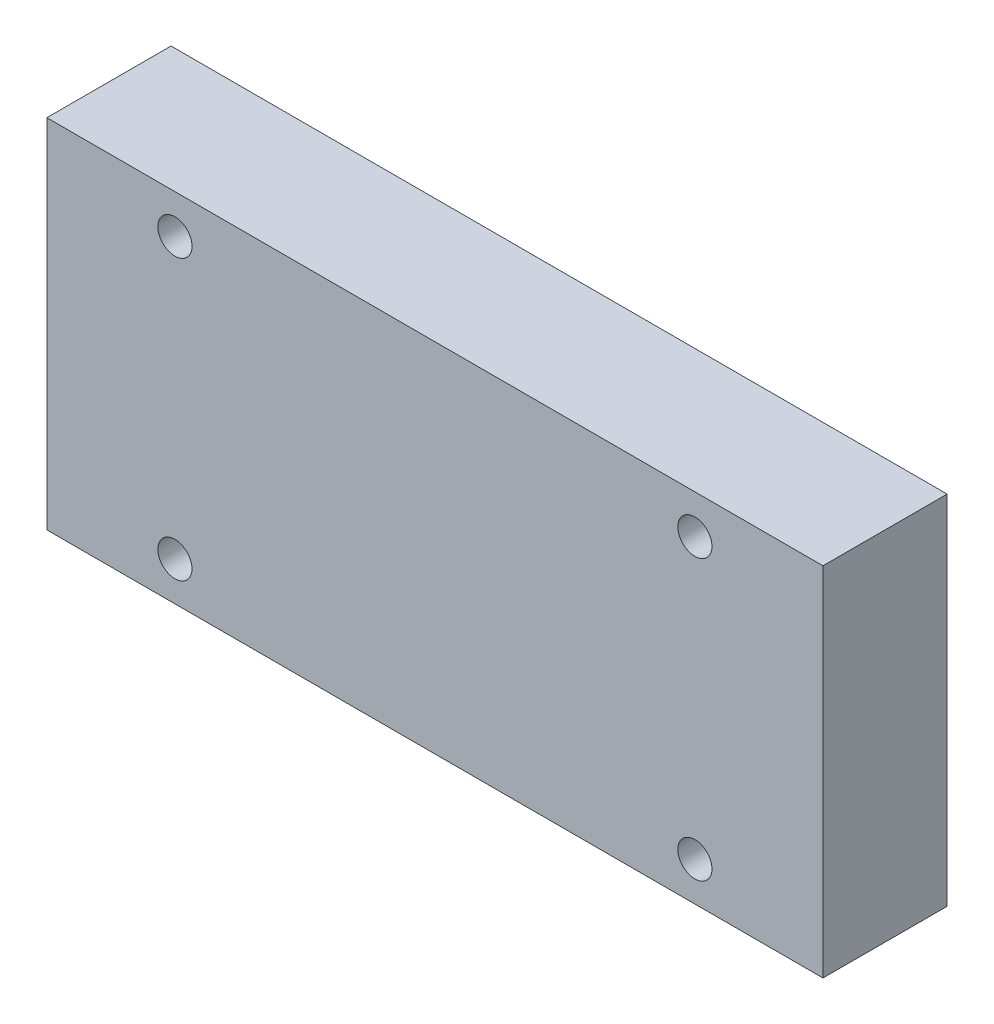
ISO-10303-21;
HEADER;
FILE_DESCRIPTION(('STEP AP214'),'2;1');
FILE_NAME('part.step','',(''),(''),'','','');
FILE_SCHEMA(('AUTOMOTIVE_DESIGN { 1 0 10303 214 1 1 1 1 }'));
ENDSEC;
DATA;
#1=APPLICATION_CONTEXT('core data for automotive mechanical design processes');
#2=APPLICATION_PROTOCOL_DEFINITION('international standard','automotive_design',2000,#1);
#3=PRODUCT_CONTEXT('',#1,'mechanical');
#4=PRODUCT('Part','Part','',(#3));
#5=PRODUCT_RELATED_PRODUCT_CATEGORY('part','',(#4));
#6=PRODUCT_DEFINITION_FORMATION('','',#4);
#7=PRODUCT_DEFINITION_CONTEXT('part definition',#1,'design');
#8=PRODUCT_DEFINITION('design','',#6,#7);
#9=PRODUCT_DEFINITION_SHAPE('','',#8);
#10=(LENGTH_UNIT() NAMED_UNIT(*) SI_UNIT(.MILLI.,.METRE.));
#11=(NAMED_UNIT(*) PLANE_ANGLE_UNIT() SI_UNIT($,.RADIAN.));
#12=(NAMED_UNIT(*) SI_UNIT($,.STERADIAN.) SOLID_ANGLE_UNIT());
#13=UNCERTAINTY_MEASURE_WITH_UNIT(LENGTH_MEASURE(1.E-05),#10,'distance_accuracy_value','');
#14=(GEOMETRIC_REPRESENTATION_CONTEXT(3) GLOBAL_UNCERTAINTY_ASSIGNED_CONTEXT((#13)) GLOBAL_UNIT_ASSIGNED_CONTEXT((#10,
#11,#12)) REPRESENTATION_CONTEXT('',''));
#15=CARTESIAN_POINT('',(0.,0.,0.));
#16=DIRECTION('',(0.,0.,1.));
#17=DIRECTION('',(1.,0.,0.));
#18=AXIS2_PLACEMENT_3D('',#15,#16,#17);
#19=CARTESIAN_POINT('',(0.,0.,8.));
#20=DIRECTION('',(0.,0.,1.));
#21=DIRECTION('',(1.,0.,0.));
#22=AXIS2_PLACEMENT_3D('',#19,#20,#21);
#23=PLANE('',#22);
#24=CARTESIAN_POINT('',(-16.75,-9.,8.));
#25=DIRECTION('',(0.,0.,1.));
#26=DIRECTION('',(-1.,0.,0.));
#27=AXIS2_PLACEMENT_3D('',#24,#25,#26);
#28=CIRCLE('',#27,1.1);
#29=CARTESIAN_POINT('',(-17.85,-9.,8.));
#30=VERTEX_POINT('',#29);
#31=EDGE_CURVE('E121',#30,#30,#28,.T.);
#32=ORIENTED_EDGE('',*,*,#31,.F.);
#33=EDGE_LOOP('',(#32));
#34=FACE_BOUND('',#33,.T.);
#35=CARTESIAN_POINT('',(16.75,9.,8.));
#36=DIRECTION('',(0.,0.,1.));
#37=DIRECTION('',(-1.,0.,0.));
#38=AXIS2_PLACEMENT_3D('',#35,#36,#37);
#39=CIRCLE('',#38,1.1);
#40=CARTESIAN_POINT('',(15.65,9.,8.));
#41=VERTEX_POINT('',#40);
#42=EDGE_CURVE('E100',#41,#41,#39,.T.);
#43=ORIENTED_EDGE('',*,*,#42,.F.);
#44=EDGE_LOOP('',(#43));
#45=FACE_BOUND('',#44,.T.);
#46=DIRECTION('',(0.,-1.,0.));
#47=VECTOR('',#46,1.);
#48=CARTESIAN_POINT('',(-25.,11.5,8.));
#49=LINE('',#48,#47);
#50=CARTESIAN_POINT('',(-25.,11.5,8.));
#51=VERTEX_POINT('',#50);
#52=CARTESIAN_POINT('',(-25.,-11.5,8.));
#53=VERTEX_POINT('',#52);
#54=EDGE_CURVE('E85',#51,#53,#49,.T.);
#55=ORIENTED_EDGE('',*,*,#54,.T.);
#56=DIRECTION('',(1.,0.,0.));
#57=VECTOR('',#56,1.);
#58=CARTESIAN_POINT('',(-25.,-11.5,8.));
#59=LINE('',#58,#57);
#60=CARTESIAN_POINT('',(25.,-11.5,8.));
#61=VERTEX_POINT('',#60);
#62=EDGE_CURVE('E80',#53,#61,#59,.T.);
#63=ORIENTED_EDGE('',*,*,#62,.T.);
#64=DIRECTION('',(0.,1.,0.));
#65=VECTOR('',#64,1.);
#66=CARTESIAN_POINT('',(25.,11.5,8.));
#67=LINE('',#66,#65);
#68=CARTESIAN_POINT('',(25.,11.5,8.));
#69=VERTEX_POINT('',#68);
#70=EDGE_CURVE('E83',#61,#69,#67,.T.);
#71=ORIENTED_EDGE('',*,*,#70,.T.);
#72=DIRECTION('',(-1.,0.,0.));
#73=VECTOR('',#72,1.);
#74=CARTESIAN_POINT('',(-25.,11.5,8.));
#75=LINE('',#74,#73);
#76=EDGE_CURVE('E50',#69,#51,#75,.T.);
#77=ORIENTED_EDGE('',*,*,#76,.T.);
#78=EDGE_LOOP('',(#55,#63,#71,#77));
#79=FACE_BOUND('',#78,.T.);
#80=CARTESIAN_POINT('',(-16.75,9.,8.));
#81=DIRECTION('',(0.,0.,1.));
#82=DIRECTION('',(1.,0.,0.));
#83=AXIS2_PLACEMENT_3D('',#80,#81,#82);
#84=CIRCLE('',#83,1.1);
#85=CARTESIAN_POINT('',(-15.65,9.,8.));
#86=VERTEX_POINT('',#85);
#87=EDGE_CURVE('E115',#86,#86,#84,.T.);
#88=ORIENTED_EDGE('',*,*,#87,.F.);
#89=EDGE_LOOP('',(#88));
#90=FACE_BOUND('',#89,.T.);
#91=CARTESIAN_POINT('',(16.75,-9.,8.));
#92=DIRECTION('',(0.,0.,1.));
#93=DIRECTION('',(1.,0.,0.));
#94=AXIS2_PLACEMENT_3D('',#91,#92,#93);
#95=CIRCLE('',#94,1.1);
#96=CARTESIAN_POINT('',(17.85,-9.,8.));
#97=VERTEX_POINT('',#96);
#98=EDGE_CURVE('E127',#97,#97,#95,.T.);
#99=ORIENTED_EDGE('',*,*,#98,.F.);
#100=EDGE_LOOP('',(#99));
#101=FACE_BOUND('',#100,.T.);
#102=ADVANCED_FACE('F33',(#34,#45,#79,#90,#101),#23,.T.);
#103=CARTESIAN_POINT('',(0.,0.,0.));
#104=DIRECTION('',(0.,0.,1.));
#105=DIRECTION('',(1.,0.,0.));
#106=AXIS2_PLACEMENT_3D('',#103,#104,#105);
#107=PLANE('',#106);
#108=DIRECTION('',(0.,-1.,0.));
#109=VECTOR('',#108,1.);
#110=CARTESIAN_POINT('',(-25.,11.5,0.));
#111=LINE('',#110,#109);
#112=CARTESIAN_POINT('',(-25.,11.5,0.));
#113=VERTEX_POINT('',#112);
#114=CARTESIAN_POINT('',(-25.,-11.5,0.));
#115=VERTEX_POINT('',#114);
#116=EDGE_CURVE('E97',#113,#115,#111,.T.);
#117=ORIENTED_EDGE('',*,*,#116,.F.);
#118=DIRECTION('',(-1.,0.,0.));
#119=VECTOR('',#118,1.);
#120=CARTESIAN_POINT('',(-25.,11.5,0.));
#121=LINE('',#120,#119);
#122=CARTESIAN_POINT('',(25.,11.5,0.));
#123=VERTEX_POINT('',#122);
#124=EDGE_CURVE('E73',#123,#113,#121,.T.);
#125=ORIENTED_EDGE('',*,*,#124,.F.);
#126=DIRECTION('',(0.,1.,0.));
#127=VECTOR('',#126,1.);
#128=CARTESIAN_POINT('',(25.,11.5,0.));
#129=LINE('',#128,#127);
#130=CARTESIAN_POINT('',(25.,-11.5,0.));
#131=VERTEX_POINT('',#130);
#132=EDGE_CURVE('E67',#131,#123,#129,.T.);
#133=ORIENTED_EDGE('',*,*,#132,.F.);
#134=DIRECTION('',(1.,0.,0.));
#135=VECTOR('',#134,1.);
#136=CARTESIAN_POINT('',(-25.,-11.5,0.));
#137=LINE('',#136,#135);
#138=EDGE_CURVE('E89',#115,#131,#137,.T.);
#139=ORIENTED_EDGE('',*,*,#138,.F.);
#140=EDGE_LOOP('',(#117,#125,#133,#139));
#141=FACE_BOUND('',#140,.T.);
#142=CARTESIAN_POINT('',(16.75,9.,0.));
#143=DIRECTION('',(0.,0.,1.));
#144=DIRECTION('',(-1.,0.,0.));
#145=AXIS2_PLACEMENT_3D('',#142,#143,#144);
#146=CIRCLE('',#145,1.1);
#147=CARTESIAN_POINT('',(15.65,9.,0.));
#148=VERTEX_POINT('',#147);
#149=EDGE_CURVE('E112',#148,#148,#146,.T.);
#150=ORIENTED_EDGE('',*,*,#149,.T.);
#151=EDGE_LOOP('',(#150));
#152=FACE_BOUND('',#151,.T.);
#153=CARTESIAN_POINT('',(-16.75,9.,0.));
#154=DIRECTION('',(0.,0.,1.));
#155=DIRECTION('',(1.,0.,0.));
#156=AXIS2_PLACEMENT_3D('',#153,#154,#155);
#157=CIRCLE('',#156,1.1);
#158=CARTESIAN_POINT('',(-15.65,9.,0.));
#159=VERTEX_POINT('',#158);
#160=EDGE_CURVE('E118',#159,#159,#157,.T.);
#161=ORIENTED_EDGE('',*,*,#160,.T.);
#162=EDGE_LOOP('',(#161));
#163=FACE_BOUND('',#162,.T.);
#164=CARTESIAN_POINT('',(-16.75,-9.,0.));
#165=DIRECTION('',(0.,0.,1.));
#166=DIRECTION('',(-1.,0.,0.));
#167=AXIS2_PLACEMENT_3D('',#164,#165,#166);
#168=CIRCLE('',#167,1.1);
#169=CARTESIAN_POINT('',(-17.85,-9.,0.));
#170=VERTEX_POINT('',#169);
#171=EDGE_CURVE('E124',#170,#170,#168,.T.);
#172=ORIENTED_EDGE('',*,*,#171,.T.);
#173=EDGE_LOOP('',(#172));
#174=FACE_BOUND('',#173,.T.);
#175=CARTESIAN_POINT('',(16.75,-9.,0.));
#176=DIRECTION('',(0.,0.,1.));
#177=DIRECTION('',(1.,0.,0.));
#178=AXIS2_PLACEMENT_3D('',#175,#176,#177);
#179=CIRCLE('',#178,1.1);
#180=CARTESIAN_POINT('',(17.85,-9.,0.));
#181=VERTEX_POINT('',#180);
#182=EDGE_CURVE('E130',#181,#181,#179,.T.);
#183=ORIENTED_EDGE('',*,*,#182,.T.);
#184=EDGE_LOOP('',(#183));
#185=FACE_BOUND('',#184,.T.);
#186=ADVANCED_FACE('F108',(#141,#152,#163,#174,#185),#107,.F.);
#187=CARTESIAN_POINT('',(-25.,11.5,8.));
#188=DIRECTION('',(1.,0.,0.));
#189=DIRECTION('',(0.,1.,0.));
#190=AXIS2_PLACEMENT_3D('',#187,#188,#189);
#191=PLANE('',#190);
#192=ORIENTED_EDGE('',*,*,#116,.T.);
#193=DIRECTION('',(0.,0.,-1.));
#194=VECTOR('',#193,1.);
#195=CARTESIAN_POINT('',(-25.,-11.5,8.));
#196=LINE('',#195,#194);
#197=EDGE_CURVE('E11',#53,#115,#196,.T.);
#198=ORIENTED_EDGE('',*,*,#197,.F.);
#199=ORIENTED_EDGE('',*,*,#54,.F.);
#200=DIRECTION('',(0.,0.,-1.));
#201=VECTOR('',#200,1.);
#202=CARTESIAN_POINT('',(-25.,11.5,8.));
#203=LINE('',#202,#201);
#204=EDGE_CURVE('E93',#51,#113,#203,.T.);
#205=ORIENTED_EDGE('',*,*,#204,.T.);
#206=EDGE_LOOP('',(#192,#198,#199,#205));
#207=FACE_BOUND('',#206,.T.);
#208=ADVANCED_FACE('F35',(#207),#191,.F.);
#209=CARTESIAN_POINT('',(-25.,-11.5,8.));
#210=DIRECTION('',(0.,1.,0.));
#211=DIRECTION('',(-1.,0.,0.));
#212=AXIS2_PLACEMENT_3D('',#209,#210,#211);
#213=PLANE('',#212);
#214=ORIENTED_EDGE('',*,*,#138,.T.);
#215=DIRECTION('',(0.,0.,-1.));
#216=VECTOR('',#215,1.);
#217=CARTESIAN_POINT('',(25.,-11.5,8.));
#218=LINE('',#217,#216);
#219=EDGE_CURVE('E42',#61,#131,#218,.T.);
#220=ORIENTED_EDGE('',*,*,#219,.F.);
#221=ORIENTED_EDGE('',*,*,#62,.F.);
#222=ORIENTED_EDGE('',*,*,#197,.T.);
#223=EDGE_LOOP('',(#214,#220,#221,#222));
#224=FACE_BOUND('',#223,.T.);
#225=ADVANCED_FACE('F88',(#224),#213,.F.);
#226=CARTESIAN_POINT('',(25.,11.5,8.));
#227=DIRECTION('',(-1.,0.,0.));
#228=DIRECTION('',(0.,-1.,0.));
#229=AXIS2_PLACEMENT_3D('',#226,#227,#228);
#230=PLANE('',#229);
#231=ORIENTED_EDGE('',*,*,#132,.T.);
#232=DIRECTION('',(0.,0.,-1.));
#233=VECTOR('',#232,1.);
#234=CARTESIAN_POINT('',(25.,11.5,8.));
#235=LINE('',#234,#233);
#236=EDGE_CURVE('E90',#69,#123,#235,.T.);
#237=ORIENTED_EDGE('',*,*,#236,.F.);
#238=ORIENTED_EDGE('',*,*,#70,.F.);
#239=ORIENTED_EDGE('',*,*,#219,.T.);
#240=EDGE_LOOP('',(#231,#237,#238,#239));
#241=FACE_BOUND('',#240,.T.);
#242=ADVANCED_FACE('F91',(#241),#230,.F.);
#243=CARTESIAN_POINT('',(-25.,11.5,8.));
#244=DIRECTION('',(0.,-1.,0.));
#245=DIRECTION('',(1.,0.,0.));
#246=AXIS2_PLACEMENT_3D('',#243,#244,#245);
#247=PLANE('',#246);
#248=ORIENTED_EDGE('',*,*,#124,.T.);
#249=ORIENTED_EDGE('',*,*,#204,.F.);
#250=ORIENTED_EDGE('',*,*,#76,.F.);
#251=ORIENTED_EDGE('',*,*,#236,.T.);
#252=EDGE_LOOP('',(#248,#249,#250,#251));
#253=FACE_BOUND('',#252,.T.);
#254=ADVANCED_FACE('F105',(#253),#247,.F.);
#255=CARTESIAN_POINT('',(16.75,9.,8.));
#256=DIRECTION('',(0.,0.,-1.));
#257=DIRECTION('',(-1.,0.,0.));
#258=AXIS2_PLACEMENT_3D('',#255,#256,#257);
#259=CYLINDRICAL_SURFACE('',#258,1.1);
#260=ORIENTED_EDGE('',*,*,#42,.T.);
#261=EDGE_LOOP('',(#260));
#262=FACE_BOUND('',#261,.T.);
#263=ORIENTED_EDGE('',*,*,#149,.F.);
#264=EDGE_LOOP('',(#263));
#265=FACE_BOUND('',#264,.T.);
#266=ADVANCED_FACE('F149',(#262,#265),#259,.F.);
#267=CARTESIAN_POINT('',(-16.75,9.,8.));
#268=DIRECTION('',(0.,0.,-1.));
#269=DIRECTION('',(-1.,0.,0.));
#270=AXIS2_PLACEMENT_3D('',#267,#268,#269);
#271=CYLINDRICAL_SURFACE('',#270,1.1);
#272=ORIENTED_EDGE('',*,*,#87,.T.);
#273=EDGE_LOOP('',(#272));
#274=FACE_BOUND('',#273,.T.);
#275=ORIENTED_EDGE('',*,*,#160,.F.);
#276=EDGE_LOOP('',(#275));
#277=FACE_BOUND('',#276,.T.);
#278=ADVANCED_FACE('F195',(#274,#277),#271,.F.);
#279=CARTESIAN_POINT('',(-16.75,-9.,8.));
#280=DIRECTION('',(0.,0.,-1.));
#281=DIRECTION('',(-1.,0.,0.));
#282=AXIS2_PLACEMENT_3D('',#279,#280,#281);
#283=CYLINDRICAL_SURFACE('',#282,1.1);
#284=ORIENTED_EDGE('',*,*,#31,.T.);
#285=EDGE_LOOP('',(#284));
#286=FACE_BOUND('',#285,.T.);
#287=ORIENTED_EDGE('',*,*,#171,.F.);
#288=EDGE_LOOP('',(#287));
#289=FACE_BOUND('',#288,.T.);
#290=ADVANCED_FACE('F203',(#286,#289),#283,.F.);
#291=CARTESIAN_POINT('',(16.75,-9.,8.));
#292=DIRECTION('',(0.,0.,-1.));
#293=DIRECTION('',(-1.,0.,0.));
#294=AXIS2_PLACEMENT_3D('',#291,#292,#293);
#295=CYLINDRICAL_SURFACE('',#294,1.1);
#296=ORIENTED_EDGE('',*,*,#98,.T.);
#297=EDGE_LOOP('',(#296));
#298=FACE_BOUND('',#297,.T.);
#299=ORIENTED_EDGE('',*,*,#182,.F.);
#300=EDGE_LOOP('',(#299));
#301=FACE_BOUND('',#300,.T.);
#302=ADVANCED_FACE('F136',(#298,#301),#295,.F.);
#303=CLOSED_SHELL('',(#102,#186,#208,#225,#242,#254,#266,#278,#290,#302));
#304=MANIFOLD_SOLID_BREP('B2',#303);
#305=ADVANCED_BREP_SHAPE_REPRESENTATION('',(#18,#304),#14);
#306=SHAPE_DEFINITION_REPRESENTATION(#9,#305);
ENDSEC;
END-ISO-10303-21;
